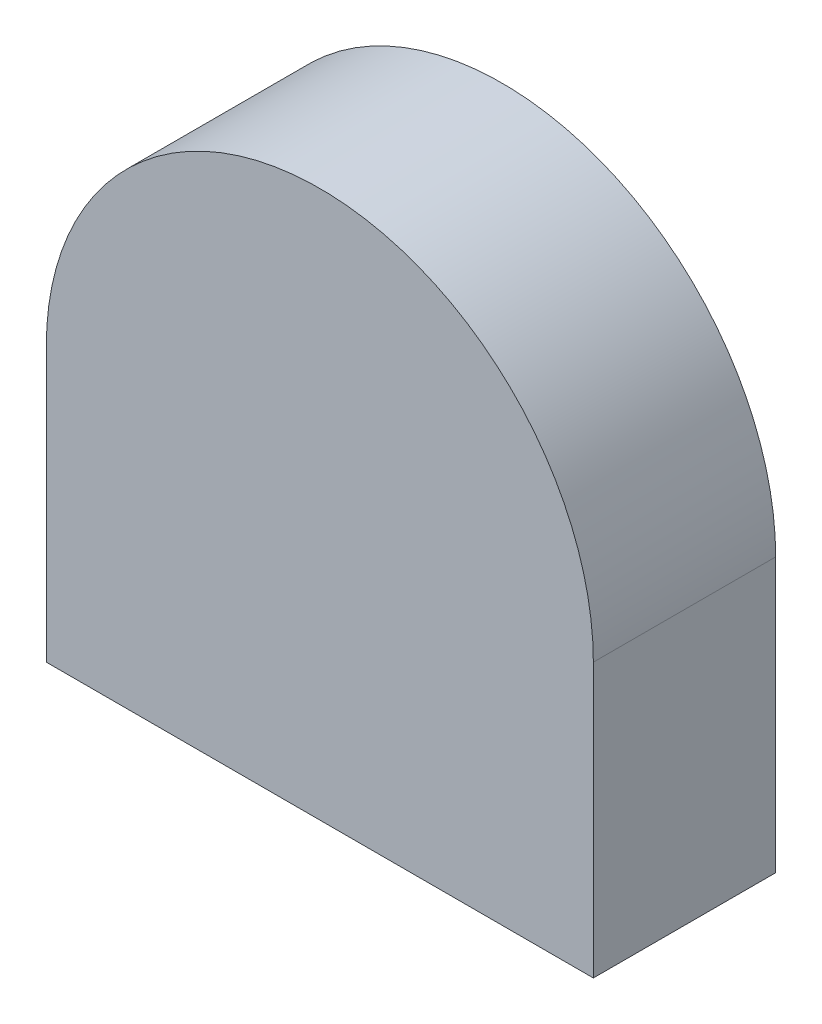
ISO-10303-21;
HEADER;
FILE_DESCRIPTION(('STEP AP214'),'2;1');
FILE_NAME('part.step','',(''),(''),'','','');
FILE_SCHEMA(('AUTOMOTIVE_DESIGN { 1 0 10303 214 1 1 1 1 }'));
ENDSEC;
DATA;
#1=APPLICATION_CONTEXT('core data for automotive mechanical design processes');
#2=APPLICATION_PROTOCOL_DEFINITION('international standard','automotive_design',2000,#1);
#3=PRODUCT_CONTEXT('',#1,'mechanical');
#4=PRODUCT('Part','Part','',(#3));
#5=PRODUCT_RELATED_PRODUCT_CATEGORY('part','',(#4));
#6=PRODUCT_DEFINITION_FORMATION('','',#4);
#7=PRODUCT_DEFINITION_CONTEXT('part definition',#1,'design');
#8=PRODUCT_DEFINITION('design','',#6,#7);
#9=PRODUCT_DEFINITION_SHAPE('','',#8);
#10=(LENGTH_UNIT() NAMED_UNIT(*) SI_UNIT(.MILLI.,.METRE.));
#11=(NAMED_UNIT(*) PLANE_ANGLE_UNIT() SI_UNIT($,.RADIAN.));
#12=(NAMED_UNIT(*) SI_UNIT($,.STERADIAN.) SOLID_ANGLE_UNIT());
#13=UNCERTAINTY_MEASURE_WITH_UNIT(LENGTH_MEASURE(1.E-05),#10,'distance_accuracy_value','');
#14=(GEOMETRIC_REPRESENTATION_CONTEXT(3) GLOBAL_UNCERTAINTY_ASSIGNED_CONTEXT((#13)) GLOBAL_UNIT_ASSIGNED_CONTEXT((#10,
#11,#12)) REPRESENTATION_CONTEXT('',''));
#15=CARTESIAN_POINT('',(0.,0.,0.));
#16=DIRECTION('',(0.,0.,1.));
#17=DIRECTION('',(1.,0.,0.));
#18=AXIS2_PLACEMENT_3D('',#15,#16,#17);
#19=CARTESIAN_POINT('',(1.02053571428571,28.4049107142857,6.35));
#20=DIRECTION('',(0.,0.,-1.));
#21=DIRECTION('',(-1.,0.,0.));
#22=AXIS2_PLACEMENT_3D('',#19,#20,#21);
#23=CYLINDRICAL_SURFACE('',#22,9.525);
#24=CARTESIAN_POINT('',(1.02053571428571,28.4049107142857,0.));
#25=DIRECTION('',(0.,0.,1.));
#26=DIRECTION('',(1.,0.,0.));
#27=AXIS2_PLACEMENT_3D('',#24,#25,#26);
#28=CIRCLE('',#27,9.525);
#29=CARTESIAN_POINT('',(-8.50446428571428,28.4049107142857,0.));
#30=VERTEX_POINT('',#29);
#31=CARTESIAN_POINT('',(10.5455357142857,28.4049107142857,0.));
#32=VERTEX_POINT('',#31);
#33=EDGE_CURVE('E99',#30,#32,#28,.F.);
#34=ORIENTED_EDGE('',*,*,#33,.F.);
#35=DIRECTION('',(0.,0.,-1.));
#36=VECTOR('',#35,1.);
#37=CARTESIAN_POINT('',(-8.50446428571428,28.4049107142857,6.35));
#38=LINE('',#37,#36);
#39=CARTESIAN_POINT('',(-8.50446428571428,28.4049107142857,6.35));
#40=VERTEX_POINT('',#39);
#41=EDGE_CURVE('E11',#40,#30,#38,.T.);
#42=ORIENTED_EDGE('',*,*,#41,.F.);
#43=CARTESIAN_POINT('',(1.02053571428571,28.4049107142857,6.35));
#44=DIRECTION('',(0.,0.,1.));
#45=DIRECTION('',(1.,0.,0.));
#46=AXIS2_PLACEMENT_3D('',#43,#44,#45);
#47=CIRCLE('',#46,9.525);
#48=CARTESIAN_POINT('',(10.5455357142857,28.4049107142857,6.35));
#49=VERTEX_POINT('',#48);
#50=EDGE_CURVE('E84',#40,#49,#47,.F.);
#51=ORIENTED_EDGE('',*,*,#50,.T.);
#52=DIRECTION('',(0.,0.,-1.));
#53=VECTOR('',#52,1.);
#54=CARTESIAN_POINT('',(10.5455357142857,28.4049107142857,6.35));
#55=LINE('',#54,#53);
#56=EDGE_CURVE('E52',#49,#32,#55,.T.);
#57=ORIENTED_EDGE('',*,*,#56,.T.);
#58=EDGE_LOOP('',(#34,#42,#51,#57));
#59=FACE_BOUND('',#58,.T.);
#60=ADVANCED_FACE('F36',(#59),#23,.T.);
#61=CARTESIAN_POINT('',(-8.50446428571428,0.,6.35));
#62=DIRECTION('',(1.,0.,0.));
#63=DIRECTION('',(0.,1.,0.));
#64=AXIS2_PLACEMENT_3D('',#61,#62,#63);
#65=PLANE('',#64);
#66=DIRECTION('',(0.,-1.,0.));
#67=VECTOR('',#66,1.);
#68=CARTESIAN_POINT('',(-8.50446428571428,0.,0.));
#69=LINE('',#68,#67);
#70=CARTESIAN_POINT('',(-8.50446428571428,18.8799107142857,0.));
#71=VERTEX_POINT('',#70);
#72=EDGE_CURVE('E90',#30,#71,#69,.T.);
#73=ORIENTED_EDGE('',*,*,#72,.T.);
#74=DIRECTION('',(0.,0.,-1.));
#75=VECTOR('',#74,1.);
#76=CARTESIAN_POINT('',(-8.50446428571428,18.8799107142857,6.35));
#77=LINE('',#76,#75);
#78=CARTESIAN_POINT('',(-8.50446428571428,18.8799107142857,6.35));
#79=VERTEX_POINT('',#78);
#80=EDGE_CURVE('E44',#79,#71,#77,.T.);
#81=ORIENTED_EDGE('',*,*,#80,.F.);
#82=DIRECTION('',(0.,-1.,0.));
#83=VECTOR('',#82,1.);
#84=CARTESIAN_POINT('',(-8.50446428571428,0.,6.35));
#85=LINE('',#84,#83);
#86=EDGE_CURVE('E78',#40,#79,#85,.T.);
#87=ORIENTED_EDGE('',*,*,#86,.F.);
#88=ORIENTED_EDGE('',*,*,#41,.T.);
#89=EDGE_LOOP('',(#73,#81,#87,#88));
#90=FACE_BOUND('',#89,.T.);
#91=ADVANCED_FACE('F88',(#90),#65,.F.);
#92=CARTESIAN_POINT('',(0.,18.8799107142857,6.35));
#93=DIRECTION('',(0.,1.,0.));
#94=DIRECTION('',(0.,0.,1.));
#95=AXIS2_PLACEMENT_3D('',#92,#93,#94);
#96=PLANE('',#95);
#97=DIRECTION('',(1.,0.,0.));
#98=VECTOR('',#97,1.);
#99=CARTESIAN_POINT('',(0.,18.8799107142857,0.));
#100=LINE('',#99,#98);
#101=CARTESIAN_POINT('',(10.5455357142857,18.8799107142857,0.));
#102=VERTEX_POINT('',#101);
#103=EDGE_CURVE('E102',#71,#102,#100,.T.);
#104=ORIENTED_EDGE('',*,*,#103,.T.);
#105=DIRECTION('',(0.,0.,-1.));
#106=VECTOR('',#105,1.);
#107=CARTESIAN_POINT('',(10.5455357142857,18.8799107142857,6.35));
#108=LINE('',#107,#106);
#109=CARTESIAN_POINT('',(10.5455357142857,18.8799107142857,6.35));
#110=VERTEX_POINT('',#109);
#111=EDGE_CURVE('E66',#110,#102,#108,.T.);
#112=ORIENTED_EDGE('',*,*,#111,.F.);
#113=DIRECTION('',(1.,0.,0.));
#114=VECTOR('',#113,1.);
#115=CARTESIAN_POINT('',(0.,18.8799107142857,6.35));
#116=LINE('',#115,#114);
#117=EDGE_CURVE('E83',#79,#110,#116,.T.);
#118=ORIENTED_EDGE('',*,*,#117,.F.);
#119=ORIENTED_EDGE('',*,*,#80,.T.);
#120=EDGE_LOOP('',(#104,#112,#118,#119));
#121=FACE_BOUND('',#120,.T.);
#122=ADVANCED_FACE('F93',(#121),#96,.F.);
#123=CARTESIAN_POINT('',(10.5455357142857,0.,6.35));
#124=DIRECTION('',(1.,0.,0.));
#125=DIRECTION('',(0.,1.,0.));
#126=AXIS2_PLACEMENT_3D('',#123,#124,#125);
#127=PLANE('',#126);
#128=DIRECTION('',(0.,-1.,0.));
#129=VECTOR('',#128,1.);
#130=CARTESIAN_POINT('',(10.5455357142857,0.,0.));
#131=LINE('',#130,#129);
#132=EDGE_CURVE('E104',#32,#102,#131,.T.);
#133=ORIENTED_EDGE('',*,*,#132,.F.);
#134=ORIENTED_EDGE('',*,*,#56,.F.);
#135=DIRECTION('',(0.,-1.,0.));
#136=VECTOR('',#135,1.);
#137=CARTESIAN_POINT('',(10.5455357142857,0.,6.35));
#138=LINE('',#137,#136);
#139=EDGE_CURVE('E94',#49,#110,#138,.T.);
#140=ORIENTED_EDGE('',*,*,#139,.T.);
#141=ORIENTED_EDGE('',*,*,#111,.T.);
#142=EDGE_LOOP('',(#133,#134,#140,#141));
#143=FACE_BOUND('',#142,.T.);
#144=ADVANCED_FACE('F109',(#143),#127,.T.);
#145=CARTESIAN_POINT('',(0.,0.,6.35));
#146=DIRECTION('',(0.,0.,1.));
#147=DIRECTION('',(1.,0.,0.));
#148=AXIS2_PLACEMENT_3D('',#145,#146,#147);
#149=PLANE('',#148);
#150=ORIENTED_EDGE('',*,*,#50,.F.);
#151=ORIENTED_EDGE('',*,*,#86,.T.);
#152=ORIENTED_EDGE('',*,*,#117,.T.);
#153=ORIENTED_EDGE('',*,*,#139,.F.);
#154=EDGE_LOOP('',(#150,#151,#152,#153));
#155=FACE_BOUND('',#154,.T.);
#156=ADVANCED_FACE('F80',(#155),#149,.T.);
#157=CARTESIAN_POINT('',(0.,0.,0.));
#158=DIRECTION('',(0.,0.,1.));
#159=DIRECTION('',(1.,0.,0.));
#160=AXIS2_PLACEMENT_3D('',#157,#158,#159);
#161=PLANE('',#160);
#162=ORIENTED_EDGE('',*,*,#33,.T.);
#163=ORIENTED_EDGE('',*,*,#132,.T.);
#164=ORIENTED_EDGE('',*,*,#103,.F.);
#165=ORIENTED_EDGE('',*,*,#72,.F.);
#166=EDGE_LOOP('',(#162,#163,#164,#165));
#167=FACE_BOUND('',#166,.T.);
#168=ADVANCED_FACE('F116',(#167),#161,.F.);
#169=CLOSED_SHELL('',(#60,#91,#122,#144,#156,#168));
#170=MANIFOLD_SOLID_BREP('B2',#169);
#171=ADVANCED_BREP_SHAPE_REPRESENTATION('',(#18,#170),#14);
#172=SHAPE_DEFINITION_REPRESENTATION(#9,#171);
ENDSEC;
END-ISO-10303-21;
